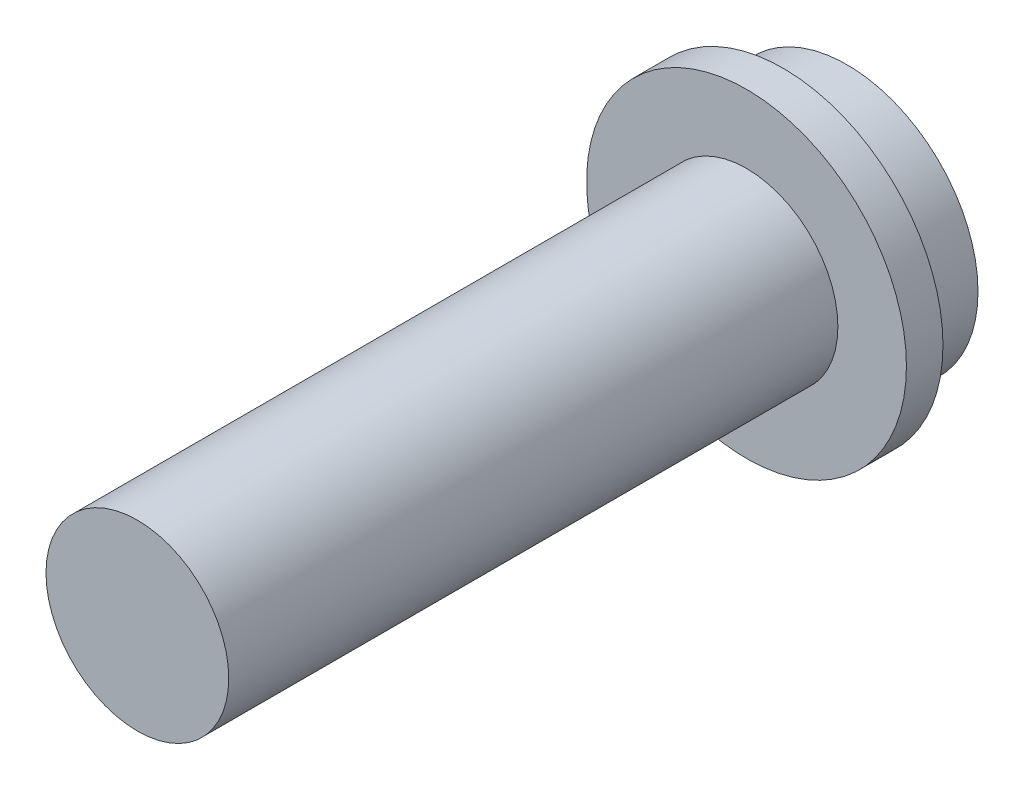
ISO-10303-21;
HEADER;
FILE_DESCRIPTION(('STEP AP214'),'2;1');
FILE_NAME('part.step','',(''),(''),'','','');
FILE_SCHEMA(('AUTOMOTIVE_DESIGN { 1 0 10303 214 1 1 1 1 }'));
ENDSEC;
DATA;
#1=APPLICATION_CONTEXT('core data for automotive mechanical design processes');
#2=APPLICATION_PROTOCOL_DEFINITION('international standard','automotive_design',2000,#1);
#3=PRODUCT_CONTEXT('',#1,'mechanical');
#4=PRODUCT('Part','Part','',(#3));
#5=PRODUCT_RELATED_PRODUCT_CATEGORY('part','',(#4));
#6=PRODUCT_DEFINITION_FORMATION('','',#4);
#7=PRODUCT_DEFINITION_CONTEXT('part definition',#1,'design');
#8=PRODUCT_DEFINITION('design','',#6,#7);
#9=PRODUCT_DEFINITION_SHAPE('','',#8);
#10=(LENGTH_UNIT() NAMED_UNIT(*) SI_UNIT(.MILLI.,.METRE.));
#11=(NAMED_UNIT(*) PLANE_ANGLE_UNIT() SI_UNIT($,.RADIAN.));
#12=(NAMED_UNIT(*) SI_UNIT($,.STERADIAN.) SOLID_ANGLE_UNIT());
#13=UNCERTAINTY_MEASURE_WITH_UNIT(LENGTH_MEASURE(1.E-05),#10,'distance_accuracy_value','');
#14=(GEOMETRIC_REPRESENTATION_CONTEXT(3) GLOBAL_UNCERTAINTY_ASSIGNED_CONTEXT((#13)) GLOBAL_UNIT_ASSIGNED_CONTEXT((#10,
#11,#12)) REPRESENTATION_CONTEXT('',''));
#15=CARTESIAN_POINT('',(0.,0.,0.));
#16=DIRECTION('',(0.,0.,1.));
#17=DIRECTION('',(1.,0.,0.));
#18=AXIS2_PLACEMENT_3D('',#15,#16,#17);
#19=CARTESIAN_POINT('',(0.,0.,-3.3));
#20=DIRECTION('',(0.,0.,1.));
#21=DIRECTION('',(1.,0.,0.));
#22=AXIS2_PLACEMENT_3D('',#19,#20,#21);
#23=PLANE('',#22);
#24=CARTESIAN_POINT('',(0.,0.,-3.3));
#25=DIRECTION('',(0.,0.,1.));
#26=DIRECTION('',(1.,0.,0.));
#27=AXIS2_PLACEMENT_3D('',#24,#25,#26);
#28=CIRCLE('',#27,4.3);
#29=CARTESIAN_POINT('',(4.3,0.,-3.3));
#30=VERTEX_POINT('',#29);
#31=EDGE_CURVE('E110',#30,#30,#28,.T.);
#32=ORIENTED_EDGE('',*,*,#31,.F.);
#33=EDGE_LOOP('',(#32));
#34=FACE_BOUND('',#33,.T.);
#35=DIRECTION('',(-0.5,-0.866025403784439,0.));
#36=VECTOR('',#35,1.);
#37=CARTESIAN_POINT('',(1.73205080756888,-1.,-3.3));
#38=LINE('',#37,#36);
#39=CARTESIAN_POINT('',(2.3094010767585,0.,-3.3));
#40=VERTEX_POINT('',#39);
#41=CARTESIAN_POINT('',(1.15470053837925,-2.,-3.3));
#42=VERTEX_POINT('',#41);
#43=EDGE_CURVE('E11',#40,#42,#38,.T.);
#44=ORIENTED_EDGE('',*,*,#43,.F.);
#45=DIRECTION('',(0.5,-0.866025403784439,0.));
#46=VECTOR('',#45,1.);
#47=CARTESIAN_POINT('',(1.73205080756888,1.,-3.3));
#48=LINE('',#47,#46);
#49=CARTESIAN_POINT('',(1.15470053837925,2.,-3.3));
#50=VERTEX_POINT('',#49);
#51=EDGE_CURVE('E50',#50,#40,#48,.T.);
#52=ORIENTED_EDGE('',*,*,#51,.F.);
#53=DIRECTION('',(1.,0.,0.));
#54=VECTOR('',#53,1.);
#55=CARTESIAN_POINT('',(0.,2.,-3.3));
#56=LINE('',#55,#54);
#57=CARTESIAN_POINT('',(-1.15470053837925,2.,-3.3));
#58=VERTEX_POINT('',#57);
#59=EDGE_CURVE('E137',#58,#50,#56,.T.);
#60=ORIENTED_EDGE('',*,*,#59,.F.);
#61=DIRECTION('',(0.5,0.866025403784438,0.));
#62=VECTOR('',#61,1.);
#63=CARTESIAN_POINT('',(-1.73205080756888,1.,-3.3));
#64=LINE('',#63,#62);
#65=CARTESIAN_POINT('',(-2.3094010767585,0.,-3.3));
#66=VERTEX_POINT('',#65);
#67=EDGE_CURVE('E134',#66,#58,#64,.T.);
#68=ORIENTED_EDGE('',*,*,#67,.F.);
#69=DIRECTION('',(-0.5,0.866025403784439,0.));
#70=VECTOR('',#69,1.);
#71=CARTESIAN_POINT('',(-1.73205080756888,-1.,-3.3));
#72=LINE('',#71,#70);
#73=CARTESIAN_POINT('',(-1.15470053837925,-2.,-3.3));
#74=VERTEX_POINT('',#73);
#75=EDGE_CURVE('E132',#74,#66,#72,.T.);
#76=ORIENTED_EDGE('',*,*,#75,.F.);
#77=DIRECTION('',(-1.,0.,0.));
#78=VECTOR('',#77,1.);
#79=CARTESIAN_POINT('',(0.,-2.,-3.3));
#80=LINE('',#79,#78);
#81=EDGE_CURVE('E126',#42,#74,#80,.T.);
#82=ORIENTED_EDGE('',*,*,#81,.F.);
#83=EDGE_LOOP('',(#44,#52,#60,#68,#76,#82));
#84=FACE_BOUND('',#83,.T.);
#85=ADVANCED_FACE('F39',(#34,#84),#23,.F.);
#86=CARTESIAN_POINT('',(0.,0.,20.));
#87=DIRECTION('',(0.,0.,-1.));
#88=DIRECTION('',(-1.,0.,0.));
#89=AXIS2_PLACEMENT_3D('',#86,#87,#88);
#90=CYLINDRICAL_SURFACE('',#89,3.);
#91=CARTESIAN_POINT('',(0.,0.,20.));
#92=DIRECTION('',(0.,0.,1.));
#93=DIRECTION('',(1.,0.,0.));
#94=AXIS2_PLACEMENT_3D('',#91,#92,#93);
#95=CIRCLE('',#94,3.);
#96=CARTESIAN_POINT('',(3.,0.,20.));
#97=VERTEX_POINT('',#96);
#98=EDGE_CURVE('E127',#97,#97,#95,.T.);
#99=ORIENTED_EDGE('',*,*,#98,.F.);
#100=EDGE_LOOP('',(#99));
#101=FACE_BOUND('',#100,.T.);
#102=CARTESIAN_POINT('',(0.,0.,0.));
#103=DIRECTION('',(0.,0.,1.));
#104=DIRECTION('',(1.,0.,0.));
#105=AXIS2_PLACEMENT_3D('',#102,#103,#104);
#106=CIRCLE('',#105,3.);
#107=CARTESIAN_POINT('',(3.,0.,0.));
#108=VERTEX_POINT('',#107);
#109=EDGE_CURVE('E124',#108,#108,#106,.T.);
#110=ORIENTED_EDGE('',*,*,#109,.T.);
#111=EDGE_LOOP('',(#110));
#112=FACE_BOUND('',#111,.T.);
#113=ADVANCED_FACE('F41',(#101,#112),#90,.T.);
#114=CARTESIAN_POINT('',(0.,0.,20.));
#115=DIRECTION('',(0.,0.,1.));
#116=DIRECTION('',(1.,0.,0.));
#117=AXIS2_PLACEMENT_3D('',#114,#115,#116);
#118=PLANE('',#117);
#119=ORIENTED_EDGE('',*,*,#98,.T.);
#120=EDGE_LOOP('',(#119));
#121=FACE_BOUND('',#120,.T.);
#122=ADVANCED_FACE('F184',(#121),#118,.T.);
#123=CARTESIAN_POINT('',(0.,0.,0.));
#124=DIRECTION('',(0.,0.,-1.));
#125=DIRECTION('',(-1.,0.,0.));
#126=AXIS2_PLACEMENT_3D('',#123,#124,#125);
#127=CYLINDRICAL_SURFACE('',#126,5.25);
#128=CARTESIAN_POINT('',(0.,0.,0.));
#129=DIRECTION('',(0.,0.,1.));
#130=DIRECTION('',(1.,0.,0.));
#131=AXIS2_PLACEMENT_3D('',#128,#129,#130);
#132=CIRCLE('',#131,5.25);
#133=CARTESIAN_POINT('',(5.25,0.,0.));
#134=VERTEX_POINT('',#133);
#135=EDGE_CURVE('E119',#134,#134,#132,.T.);
#136=ORIENTED_EDGE('',*,*,#135,.F.);
#137=EDGE_LOOP('',(#136));
#138=FACE_BOUND('',#137,.T.);
#139=CARTESIAN_POINT('',(0.,0.,-1.2));
#140=DIRECTION('',(0.,0.,1.));
#141=DIRECTION('',(1.,0.,0.));
#142=AXIS2_PLACEMENT_3D('',#139,#140,#141);
#143=CIRCLE('',#142,5.25);
#144=CARTESIAN_POINT('',(5.25,0.,-1.2));
#145=VERTEX_POINT('',#144);
#146=EDGE_CURVE('E117',#145,#145,#143,.T.);
#147=ORIENTED_EDGE('',*,*,#146,.T.);
#148=EDGE_LOOP('',(#147));
#149=FACE_BOUND('',#148,.T.);
#150=ADVANCED_FACE('F197',(#138,#149),#127,.T.);
#151=CARTESIAN_POINT('',(0.,0.,0.));
#152=DIRECTION('',(0.,0.,1.));
#153=DIRECTION('',(1.,0.,0.));
#154=AXIS2_PLACEMENT_3D('',#151,#152,#153);
#155=PLANE('',#154);
#156=ORIENTED_EDGE('',*,*,#109,.F.);
#157=EDGE_LOOP('',(#156));
#158=FACE_BOUND('',#157,.T.);
#159=ORIENTED_EDGE('',*,*,#135,.T.);
#160=EDGE_LOOP('',(#159));
#161=FACE_BOUND('',#160,.T.);
#162=ADVANCED_FACE('F193',(#158,#161),#155,.T.);
#163=CARTESIAN_POINT('',(0.,0.,-1.2));
#164=DIRECTION('',(0.,0.,1.));
#165=DIRECTION('',(1.,0.,0.));
#166=AXIS2_PLACEMENT_3D('',#163,#164,#165);
#167=PLANE('',#166);
#168=CARTESIAN_POINT('',(0.,0.,-1.2));
#169=DIRECTION('',(0.,0.,1.));
#170=DIRECTION('',(1.,0.,0.));
#171=AXIS2_PLACEMENT_3D('',#168,#169,#170);
#172=CIRCLE('',#171,4.3);
#173=CARTESIAN_POINT('',(4.3,0.,-1.2));
#174=VERTEX_POINT('',#173);
#175=EDGE_CURVE('E111',#174,#174,#172,.T.);
#176=ORIENTED_EDGE('',*,*,#175,.T.);
#177=EDGE_LOOP('',(#176));
#178=FACE_BOUND('',#177,.T.);
#179=ORIENTED_EDGE('',*,*,#146,.F.);
#180=EDGE_LOOP('',(#179));
#181=FACE_BOUND('',#180,.T.);
#182=ADVANCED_FACE('F194',(#178,#181),#167,.F.);
#183=CARTESIAN_POINT('',(0.,0.,-1.2));
#184=DIRECTION('',(0.,0.,-1.));
#185=DIRECTION('',(-1.,0.,0.));
#186=AXIS2_PLACEMENT_3D('',#183,#184,#185);
#187=CYLINDRICAL_SURFACE('',#186,4.3);
#188=ORIENTED_EDGE('',*,*,#175,.F.);
#189=EDGE_LOOP('',(#188));
#190=FACE_BOUND('',#189,.T.);
#191=ORIENTED_EDGE('',*,*,#31,.T.);
#192=EDGE_LOOP('',(#191));
#193=FACE_BOUND('',#192,.T.);
#194=ADVANCED_FACE('F192',(#190,#193),#187,.T.);
#195=CARTESIAN_POINT('',(1.15470053837925,-2.,-1.2));
#196=DIRECTION('',(-0.866025403784439,0.5,0.));
#197=DIRECTION('',(-0.5,-0.866025403784439,0.));
#198=AXIS2_PLACEMENT_3D('',#195,#196,#197);
#199=PLANE('',#198);
#200=ORIENTED_EDGE('',*,*,#43,.T.);
#201=DIRECTION('',(0.,0.,-1.));
#202=VECTOR('',#201,1.);
#203=CARTESIAN_POINT('',(1.15470053837925,-2.,-1.2));
#204=LINE('',#203,#202);
#205=CARTESIAN_POINT('',(1.15470053837925,-2.,-1.2));
#206=VERTEX_POINT('',#205);
#207=EDGE_CURVE('E53',#206,#42,#204,.T.);
#208=ORIENTED_EDGE('',*,*,#207,.F.);
#209=DIRECTION('',(0.5,0.866025403784439,0.));
#210=VECTOR('',#209,1.);
#211=CARTESIAN_POINT('',(1.15470053837925,-2.,-1.2));
#212=LINE('',#211,#210);
#213=CARTESIAN_POINT('',(2.3094010767585,0.,-1.2));
#214=VERTEX_POINT('',#213);
#215=EDGE_CURVE('E98',#206,#214,#212,.T.);
#216=ORIENTED_EDGE('',*,*,#215,.T.);
#217=DIRECTION('',(0.,0.,-1.));
#218=VECTOR('',#217,1.);
#219=CARTESIAN_POINT('',(2.3094010767585,0.,-1.2));
#220=LINE('',#219,#218);
#221=EDGE_CURVE('E101',#214,#40,#220,.T.);
#222=ORIENTED_EDGE('',*,*,#221,.T.);
#223=EDGE_LOOP('',(#200,#208,#216,#222));
#224=FACE_BOUND('',#223,.T.);
#225=ADVANCED_FACE('F105',(#224),#199,.T.);
#226=CARTESIAN_POINT('',(2.3094010767585,0.,-1.2));
#227=DIRECTION('',(-0.866025403784439,-0.5,0.));
#228=DIRECTION('',(0.5,-0.866025403784439,0.));
#229=AXIS2_PLACEMENT_3D('',#226,#227,#228);
#230=PLANE('',#229);
#231=ORIENTED_EDGE('',*,*,#51,.T.);
#232=ORIENTED_EDGE('',*,*,#221,.F.);
#233=DIRECTION('',(-0.5,0.866025403784439,0.));
#234=VECTOR('',#233,1.);
#235=CARTESIAN_POINT('',(2.3094010767585,0.,-1.2));
#236=LINE('',#235,#234);
#237=CARTESIAN_POINT('',(1.15470053837925,2.,-1.2));
#238=VERTEX_POINT('',#237);
#239=EDGE_CURVE('E92',#214,#238,#236,.T.);
#240=ORIENTED_EDGE('',*,*,#239,.T.);
#241=DIRECTION('',(0.,0.,-1.));
#242=VECTOR('',#241,1.);
#243=CARTESIAN_POINT('',(1.15470053837925,2.,-1.2));
#244=LINE('',#243,#242);
#245=EDGE_CURVE('E108',#238,#50,#244,.T.);
#246=ORIENTED_EDGE('',*,*,#245,.T.);
#247=EDGE_LOOP('',(#231,#232,#240,#246));
#248=FACE_BOUND('',#247,.T.);
#249=ADVANCED_FACE('F106',(#248),#230,.T.);
#250=CARTESIAN_POINT('',(1.15470053837925,2.,-1.2));
#251=DIRECTION('',(0.,-1.,0.));
#252=DIRECTION('',(1.,0.,0.));
#253=AXIS2_PLACEMENT_3D('',#250,#251,#252);
#254=PLANE('',#253);
#255=ORIENTED_EDGE('',*,*,#59,.T.);
#256=ORIENTED_EDGE('',*,*,#245,.F.);
#257=DIRECTION('',(-1.,0.,0.));
#258=VECTOR('',#257,1.);
#259=CARTESIAN_POINT('',(1.15470053837925,2.,-1.2));
#260=LINE('',#259,#258);
#261=CARTESIAN_POINT('',(-1.15470053837925,2.,-1.2));
#262=VERTEX_POINT('',#261);
#263=EDGE_CURVE('E96',#238,#262,#260,.T.);
#264=ORIENTED_EDGE('',*,*,#263,.T.);
#265=DIRECTION('',(0.,0.,-1.));
#266=VECTOR('',#265,1.);
#267=CARTESIAN_POINT('',(-1.15470053837925,2.,-1.2));
#268=LINE('',#267,#266);
#269=EDGE_CURVE('E113',#262,#58,#268,.T.);
#270=ORIENTED_EDGE('',*,*,#269,.T.);
#271=EDGE_LOOP('',(#255,#256,#264,#270));
#272=FACE_BOUND('',#271,.T.);
#273=ADVANCED_FACE('F142',(#272),#254,.T.);
#274=CARTESIAN_POINT('',(-1.15470053837925,2.,-1.2));
#275=DIRECTION('',(0.866025403784438,-0.5,0.));
#276=DIRECTION('',(0.5,0.866025403784438,0.));
#277=AXIS2_PLACEMENT_3D('',#274,#275,#276);
#278=PLANE('',#277);
#279=ORIENTED_EDGE('',*,*,#67,.T.);
#280=ORIENTED_EDGE('',*,*,#269,.F.);
#281=DIRECTION('',(-0.5,-0.866025403784438,0.));
#282=VECTOR('',#281,1.);
#283=CARTESIAN_POINT('',(-1.15470053837925,2.,-1.2));
#284=LINE('',#283,#282);
#285=CARTESIAN_POINT('',(-2.3094010767585,0.,-1.2));
#286=VERTEX_POINT('',#285);
#287=EDGE_CURVE('E164',#262,#286,#284,.T.);
#288=ORIENTED_EDGE('',*,*,#287,.T.);
#289=DIRECTION('',(0.,0.,-1.));
#290=VECTOR('',#289,1.);
#291=CARTESIAN_POINT('',(-2.3094010767585,0.,-1.2));
#292=LINE('',#291,#290);
#293=EDGE_CURVE('E157',#286,#66,#292,.T.);
#294=ORIENTED_EDGE('',*,*,#293,.T.);
#295=EDGE_LOOP('',(#279,#280,#288,#294));
#296=FACE_BOUND('',#295,.T.);
#297=ADVANCED_FACE('F166',(#296),#278,.T.);
#298=CARTESIAN_POINT('',(-2.3094010767585,0.,-1.2));
#299=DIRECTION('',(0.866025403784439,0.5,0.));
#300=DIRECTION('',(-0.5,0.866025403784439,0.));
#301=AXIS2_PLACEMENT_3D('',#298,#299,#300);
#302=PLANE('',#301);
#303=ORIENTED_EDGE('',*,*,#75,.T.);
#304=ORIENTED_EDGE('',*,*,#293,.F.);
#305=DIRECTION('',(0.5,-0.866025403784439,0.));
#306=VECTOR('',#305,1.);
#307=CARTESIAN_POINT('',(-2.3094010767585,0.,-1.2));
#308=LINE('',#307,#306);
#309=CARTESIAN_POINT('',(-1.15470053837925,-2.,-1.2));
#310=VERTEX_POINT('',#309);
#311=EDGE_CURVE('E156',#286,#310,#308,.T.);
#312=ORIENTED_EDGE('',*,*,#311,.T.);
#313=DIRECTION('',(0.,0.,-1.));
#314=VECTOR('',#313,1.);
#315=CARTESIAN_POINT('',(-1.15470053837925,-2.,-1.2));
#316=LINE('',#315,#314);
#317=EDGE_CURVE('E148',#310,#74,#316,.T.);
#318=ORIENTED_EDGE('',*,*,#317,.T.);
#319=EDGE_LOOP('',(#303,#304,#312,#318));
#320=FACE_BOUND('',#319,.T.);
#321=ADVANCED_FACE('F155',(#320),#302,.T.);
#322=CARTESIAN_POINT('',(-1.15470053837925,-2.,-1.2));
#323=DIRECTION('',(0.,1.,0.));
#324=DIRECTION('',(-1.,0.,0.));
#325=AXIS2_PLACEMENT_3D('',#322,#323,#324);
#326=PLANE('',#325);
#327=ORIENTED_EDGE('',*,*,#81,.T.);
#328=ORIENTED_EDGE('',*,*,#317,.F.);
#329=DIRECTION('',(1.,0.,0.));
#330=VECTOR('',#329,1.);
#331=CARTESIAN_POINT('',(-1.15470053837925,-2.,-1.2));
#332=LINE('',#331,#330);
#333=EDGE_CURVE('E160',#310,#206,#332,.T.);
#334=ORIENTED_EDGE('',*,*,#333,.T.);
#335=ORIENTED_EDGE('',*,*,#207,.T.);
#336=EDGE_LOOP('',(#327,#328,#334,#335));
#337=FACE_BOUND('',#336,.T.);
#338=ADVANCED_FACE('F146',(#337),#326,.T.);
#339=CARTESIAN_POINT('',(0.,0.,-1.2));
#340=DIRECTION('',(0.,0.,1.));
#341=DIRECTION('',(1.,0.,0.));
#342=AXIS2_PLACEMENT_3D('',#339,#340,#341);
#343=PLANE('',#342);
#344=ORIENTED_EDGE('',*,*,#215,.F.);
#345=ORIENTED_EDGE('',*,*,#333,.F.);
#346=ORIENTED_EDGE('',*,*,#311,.F.);
#347=ORIENTED_EDGE('',*,*,#287,.F.);
#348=ORIENTED_EDGE('',*,*,#263,.F.);
#349=ORIENTED_EDGE('',*,*,#239,.F.);
#350=EDGE_LOOP('',(#344,#345,#346,#347,#348,#349));
#351=FACE_BOUND('',#350,.T.);
#352=ADVANCED_FACE('F93',(#351),#343,.F.);
#353=CLOSED_SHELL('',(#85,#113,#122,#150,#162,#182,#194,#225,#249,#273,#297,#321,#338,#352));
#354=MANIFOLD_SOLID_BREP('B2',#353);
#355=ADVANCED_BREP_SHAPE_REPRESENTATION('',(#18,#354),#14);
#356=SHAPE_DEFINITION_REPRESENTATION(#9,#355);
ENDSEC;
END-ISO-10303-21;
